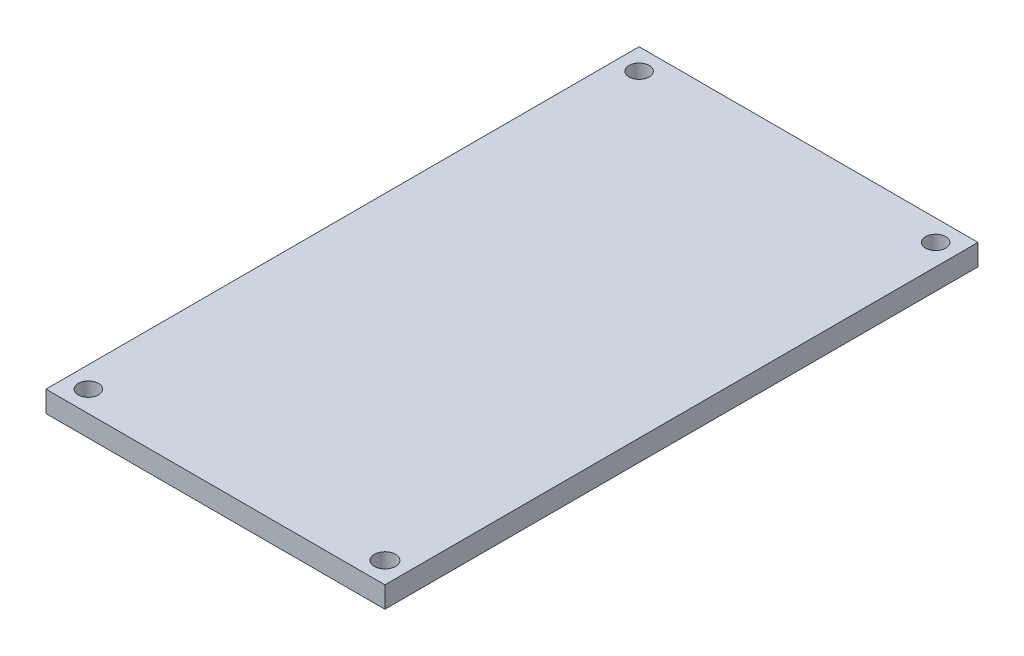
ISO-10303-21;
HEADER;
FILE_DESCRIPTION(('STEP AP214'),'2;1');
FILE_NAME('part.step','',(''),(''),'','','');
FILE_SCHEMA(('AUTOMOTIVE_DESIGN { 1 0 10303 214 1 1 1 1 }'));
ENDSEC;
DATA;
#1=APPLICATION_CONTEXT('core data for automotive mechanical design processes');
#2=APPLICATION_PROTOCOL_DEFINITION('international standard','automotive_design',2000,#1);
#3=PRODUCT_CONTEXT('',#1,'mechanical');
#4=PRODUCT('Part','Part','',(#3));
#5=PRODUCT_RELATED_PRODUCT_CATEGORY('part','',(#4));
#6=PRODUCT_DEFINITION_FORMATION('','',#4);
#7=PRODUCT_DEFINITION_CONTEXT('part definition',#1,'design');
#8=PRODUCT_DEFINITION('design','',#6,#7);
#9=PRODUCT_DEFINITION_SHAPE('','',#8);
#10=(LENGTH_UNIT() NAMED_UNIT(*) SI_UNIT(.MILLI.,.METRE.));
#11=(NAMED_UNIT(*) PLANE_ANGLE_UNIT() SI_UNIT($,.RADIAN.));
#12=(NAMED_UNIT(*) SI_UNIT($,.STERADIAN.) SOLID_ANGLE_UNIT());
#13=UNCERTAINTY_MEASURE_WITH_UNIT(LENGTH_MEASURE(1.E-05),#10,'distance_accuracy_value','');
#14=(GEOMETRIC_REPRESENTATION_CONTEXT(3) GLOBAL_UNCERTAINTY_ASSIGNED_CONTEXT((#13)) GLOBAL_UNIT_ASSIGNED_CONTEXT((#10,
#11,#12)) REPRESENTATION_CONTEXT('',''));
#15=CARTESIAN_POINT('',(0.,0.,0.));
#16=DIRECTION('',(0.,0.,1.));
#17=DIRECTION('',(1.,0.,0.));
#18=AXIS2_PLACEMENT_3D('',#15,#16,#17);
#19=CARTESIAN_POINT('',(0.,2.,0.));
#20=DIRECTION('',(0.,1.,0.));
#21=DIRECTION('',(0.,0.,1.));
#22=AXIS2_PLACEMENT_3D('',#19,#20,#21);
#23=PLANE('',#22);
#24=CARTESIAN_POINT('',(-14.,2.,26.));
#25=DIRECTION('',(0.,1.,0.));
#26=DIRECTION('',(0.,0.,1.));
#27=AXIS2_PLACEMENT_3D('',#24,#25,#26);
#28=CIRCLE('',#27,0.949999999999999);
#29=CARTESIAN_POINT('',(-14.,2.,26.95));
#30=VERTEX_POINT('',#29);
#31=EDGE_CURVE('E126',#30,#30,#28,.T.);
#32=ORIENTED_EDGE('',*,*,#31,.F.);
#33=EDGE_LOOP('',(#32));
#34=FACE_BOUND('',#33,.T.);
#35=CARTESIAN_POINT('',(-14.,2.,-26.));
#36=DIRECTION('',(0.,1.,0.));
#37=DIRECTION('',(0.,0.,1.));
#38=AXIS2_PLACEMENT_3D('',#35,#36,#37);
#39=CIRCLE('',#38,0.949999999999999);
#40=CARTESIAN_POINT('',(-14.,2.,-25.05));
#41=VERTEX_POINT('',#40);
#42=EDGE_CURVE('E105',#41,#41,#39,.T.);
#43=ORIENTED_EDGE('',*,*,#42,.F.);
#44=EDGE_LOOP('',(#43));
#45=FACE_BOUND('',#44,.T.);
#46=DIRECTION('',(0.,0.,1.));
#47=VECTOR('',#46,1.);
#48=CARTESIAN_POINT('',(-16.,2.,28.));
#49=LINE('',#48,#47);
#50=CARTESIAN_POINT('',(-16.,2.,-28.));
#51=VERTEX_POINT('',#50);
#52=CARTESIAN_POINT('',(-16.,2.,28.));
#53=VERTEX_POINT('',#52);
#54=EDGE_CURVE('E90',#51,#53,#49,.T.);
#55=ORIENTED_EDGE('',*,*,#54,.T.);
#56=DIRECTION('',(1.,0.,0.));
#57=VECTOR('',#56,1.);
#58=CARTESIAN_POINT('',(16.,2.,28.));
#59=LINE('',#58,#57);
#60=CARTESIAN_POINT('',(16.,2.,28.));
#61=VERTEX_POINT('',#60);
#62=EDGE_CURVE('E85',#53,#61,#59,.T.);
#63=ORIENTED_EDGE('',*,*,#62,.T.);
#64=DIRECTION('',(0.,0.,-1.));
#65=VECTOR('',#64,1.);
#66=CARTESIAN_POINT('',(16.,2.,28.));
#67=LINE('',#66,#65);
#68=CARTESIAN_POINT('',(16.,2.,-28.));
#69=VERTEX_POINT('',#68);
#70=EDGE_CURVE('E88',#61,#69,#67,.T.);
#71=ORIENTED_EDGE('',*,*,#70,.T.);
#72=DIRECTION('',(-1.,0.,0.));
#73=VECTOR('',#72,1.);
#74=CARTESIAN_POINT('',(16.,2.,-28.));
#75=LINE('',#74,#73);
#76=EDGE_CURVE('E55',#69,#51,#75,.T.);
#77=ORIENTED_EDGE('',*,*,#76,.T.);
#78=EDGE_LOOP('',(#55,#63,#71,#77));
#79=FACE_BOUND('',#78,.T.);
#80=CARTESIAN_POINT('',(14.,2.,-26.));
#81=DIRECTION('',(0.,1.,0.));
#82=DIRECTION('',(0.,0.,1.));
#83=AXIS2_PLACEMENT_3D('',#80,#81,#82);
#84=CIRCLE('',#83,0.949999999999999);
#85=CARTESIAN_POINT('',(14.,2.,-25.05));
#86=VERTEX_POINT('',#85);
#87=EDGE_CURVE('E120',#86,#86,#84,.T.);
#88=ORIENTED_EDGE('',*,*,#87,.F.);
#89=EDGE_LOOP('',(#88));
#90=FACE_BOUND('',#89,.T.);
#91=CARTESIAN_POINT('',(14.,2.,26.));
#92=DIRECTION('',(0.,1.,0.));
#93=DIRECTION('',(0.,0.,1.));
#94=AXIS2_PLACEMENT_3D('',#91,#92,#93);
#95=CIRCLE('',#94,1.);
#96=CARTESIAN_POINT('',(14.,2.,27.));
#97=VERTEX_POINT('',#96);
#98=EDGE_CURVE('E132',#97,#97,#95,.T.);
#99=ORIENTED_EDGE('',*,*,#98,.F.);
#100=EDGE_LOOP('',(#99));
#101=FACE_BOUND('',#100,.T.);
#102=ADVANCED_FACE('F38',(#34,#45,#79,#90,#101),#23,.T.);
#103=CARTESIAN_POINT('',(0.,0.,0.));
#104=DIRECTION('',(0.,1.,0.));
#105=DIRECTION('',(0.,0.,1.));
#106=AXIS2_PLACEMENT_3D('',#103,#104,#105);
#107=PLANE('',#106);
#108=DIRECTION('',(0.,0.,1.));
#109=VECTOR('',#108,1.);
#110=CARTESIAN_POINT('',(-16.,0.,28.));
#111=LINE('',#110,#109);
#112=CARTESIAN_POINT('',(-16.,0.,-28.));
#113=VERTEX_POINT('',#112);
#114=CARTESIAN_POINT('',(-16.,0.,28.));
#115=VERTEX_POINT('',#114);
#116=EDGE_CURVE('E102',#113,#115,#111,.T.);
#117=ORIENTED_EDGE('',*,*,#116,.F.);
#118=DIRECTION('',(-1.,0.,0.));
#119=VECTOR('',#118,1.);
#120=CARTESIAN_POINT('',(16.,0.,-28.));
#121=LINE('',#120,#119);
#122=CARTESIAN_POINT('',(16.,0.,-28.));
#123=VERTEX_POINT('',#122);
#124=EDGE_CURVE('E78',#123,#113,#121,.T.);
#125=ORIENTED_EDGE('',*,*,#124,.F.);
#126=DIRECTION('',(0.,0.,-1.));
#127=VECTOR('',#126,1.);
#128=CARTESIAN_POINT('',(16.,0.,28.));
#129=LINE('',#128,#127);
#130=CARTESIAN_POINT('',(16.,0.,28.));
#131=VERTEX_POINT('',#130);
#132=EDGE_CURVE('E72',#131,#123,#129,.T.);
#133=ORIENTED_EDGE('',*,*,#132,.F.);
#134=DIRECTION('',(1.,0.,0.));
#135=VECTOR('',#134,1.);
#136=CARTESIAN_POINT('',(16.,0.,28.));
#137=LINE('',#136,#135);
#138=EDGE_CURVE('E94',#115,#131,#137,.T.);
#139=ORIENTED_EDGE('',*,*,#138,.F.);
#140=EDGE_LOOP('',(#117,#125,#133,#139));
#141=FACE_BOUND('',#140,.T.);
#142=CARTESIAN_POINT('',(-14.,0.,-26.));
#143=DIRECTION('',(0.,1.,0.));
#144=DIRECTION('',(0.,0.,1.));
#145=AXIS2_PLACEMENT_3D('',#142,#143,#144);
#146=CIRCLE('',#145,0.949999999999999);
#147=CARTESIAN_POINT('',(-14.,0.,-25.05));
#148=VERTEX_POINT('',#147);
#149=EDGE_CURVE('E117',#148,#148,#146,.T.);
#150=ORIENTED_EDGE('',*,*,#149,.T.);
#151=EDGE_LOOP('',(#150));
#152=FACE_BOUND('',#151,.T.);
#153=CARTESIAN_POINT('',(14.,0.,-26.));
#154=DIRECTION('',(0.,1.,0.));
#155=DIRECTION('',(0.,0.,1.));
#156=AXIS2_PLACEMENT_3D('',#153,#154,#155);
#157=CIRCLE('',#156,0.949999999999999);
#158=CARTESIAN_POINT('',(14.,0.,-25.05));
#159=VERTEX_POINT('',#158);
#160=EDGE_CURVE('E123',#159,#159,#157,.T.);
#161=ORIENTED_EDGE('',*,*,#160,.T.);
#162=EDGE_LOOP('',(#161));
#163=FACE_BOUND('',#162,.T.);
#164=CARTESIAN_POINT('',(-14.,0.,26.));
#165=DIRECTION('',(0.,1.,0.));
#166=DIRECTION('',(0.,0.,1.));
#167=AXIS2_PLACEMENT_3D('',#164,#165,#166);
#168=CIRCLE('',#167,0.949999999999999);
#169=CARTESIAN_POINT('',(-14.,0.,26.95));
#170=VERTEX_POINT('',#169);
#171=EDGE_CURVE('E129',#170,#170,#168,.T.);
#172=ORIENTED_EDGE('',*,*,#171,.T.);
#173=EDGE_LOOP('',(#172));
#174=FACE_BOUND('',#173,.T.);
#175=CARTESIAN_POINT('',(14.,0.,26.));
#176=DIRECTION('',(0.,1.,0.));
#177=DIRECTION('',(0.,0.,1.));
#178=AXIS2_PLACEMENT_3D('',#175,#176,#177);
#179=CIRCLE('',#178,1.);
#180=CARTESIAN_POINT('',(14.,0.,27.));
#181=VERTEX_POINT('',#180);
#182=EDGE_CURVE('E135',#181,#181,#179,.T.);
#183=ORIENTED_EDGE('',*,*,#182,.T.);
#184=EDGE_LOOP('',(#183));
#185=FACE_BOUND('',#184,.T.);
#186=ADVANCED_FACE('F113',(#141,#152,#163,#174,#185),#107,.F.);
#187=CARTESIAN_POINT('',(-16.,2.,28.));
#188=DIRECTION('',(1.,0.,0.));
#189=DIRECTION('',(0.,0.,-1.));
#190=AXIS2_PLACEMENT_3D('',#187,#188,#189);
#191=PLANE('',#190);
#192=ORIENTED_EDGE('',*,*,#116,.T.);
#193=DIRECTION('',(0.,-1.,0.));
#194=VECTOR('',#193,1.);
#195=CARTESIAN_POINT('',(-16.,2.,28.));
#196=LINE('',#195,#194);
#197=EDGE_CURVE('E11',#53,#115,#196,.T.);
#198=ORIENTED_EDGE('',*,*,#197,.F.);
#199=ORIENTED_EDGE('',*,*,#54,.F.);
#200=DIRECTION('',(0.,-1.,0.));
#201=VECTOR('',#200,1.);
#202=CARTESIAN_POINT('',(-16.,2.,-28.));
#203=LINE('',#202,#201);
#204=EDGE_CURVE('E98',#51,#113,#203,.T.);
#205=ORIENTED_EDGE('',*,*,#204,.T.);
#206=EDGE_LOOP('',(#192,#198,#199,#205));
#207=FACE_BOUND('',#206,.T.);
#208=ADVANCED_FACE('F40',(#207),#191,.F.);
#209=CARTESIAN_POINT('',(16.,2.,28.));
#210=DIRECTION('',(0.,0.,-1.));
#211=DIRECTION('',(-1.,0.,0.));
#212=AXIS2_PLACEMENT_3D('',#209,#210,#211);
#213=PLANE('',#212);
#214=ORIENTED_EDGE('',*,*,#138,.T.);
#215=DIRECTION('',(0.,-1.,0.));
#216=VECTOR('',#215,1.);
#217=CARTESIAN_POINT('',(16.,2.,28.));
#218=LINE('',#217,#216);
#219=EDGE_CURVE('E47',#61,#131,#218,.T.);
#220=ORIENTED_EDGE('',*,*,#219,.F.);
#221=ORIENTED_EDGE('',*,*,#62,.F.);
#222=ORIENTED_EDGE('',*,*,#197,.T.);
#223=EDGE_LOOP('',(#214,#220,#221,#222));
#224=FACE_BOUND('',#223,.T.);
#225=ADVANCED_FACE('F93',(#224),#213,.F.);
#226=CARTESIAN_POINT('',(16.,2.,28.));
#227=DIRECTION('',(-1.,0.,0.));
#228=DIRECTION('',(0.,0.,1.));
#229=AXIS2_PLACEMENT_3D('',#226,#227,#228);
#230=PLANE('',#229);
#231=ORIENTED_EDGE('',*,*,#132,.T.);
#232=DIRECTION('',(0.,-1.,0.));
#233=VECTOR('',#232,1.);
#234=CARTESIAN_POINT('',(16.,2.,-28.));
#235=LINE('',#234,#233);
#236=EDGE_CURVE('E95',#69,#123,#235,.T.);
#237=ORIENTED_EDGE('',*,*,#236,.F.);
#238=ORIENTED_EDGE('',*,*,#70,.F.);
#239=ORIENTED_EDGE('',*,*,#219,.T.);
#240=EDGE_LOOP('',(#231,#237,#238,#239));
#241=FACE_BOUND('',#240,.T.);
#242=ADVANCED_FACE('F96',(#241),#230,.F.);
#243=CARTESIAN_POINT('',(16.,2.,-28.));
#244=DIRECTION('',(0.,0.,1.));
#245=DIRECTION('',(1.,0.,0.));
#246=AXIS2_PLACEMENT_3D('',#243,#244,#245);
#247=PLANE('',#246);
#248=ORIENTED_EDGE('',*,*,#124,.T.);
#249=ORIENTED_EDGE('',*,*,#204,.F.);
#250=ORIENTED_EDGE('',*,*,#76,.F.);
#251=ORIENTED_EDGE('',*,*,#236,.T.);
#252=EDGE_LOOP('',(#248,#249,#250,#251));
#253=FACE_BOUND('',#252,.T.);
#254=ADVANCED_FACE('F110',(#253),#247,.F.);
#255=CARTESIAN_POINT('',(-14.,2.,-26.));
#256=DIRECTION('',(0.,-1.,0.));
#257=DIRECTION('',(0.,0.,-1.));
#258=AXIS2_PLACEMENT_3D('',#255,#256,#257);
#259=CYLINDRICAL_SURFACE('',#258,0.949999999999999);
#260=ORIENTED_EDGE('',*,*,#42,.T.);
#261=EDGE_LOOP('',(#260));
#262=FACE_BOUND('',#261,.T.);
#263=ORIENTED_EDGE('',*,*,#149,.F.);
#264=EDGE_LOOP('',(#263));
#265=FACE_BOUND('',#264,.T.);
#266=ADVANCED_FACE('F154',(#262,#265),#259,.F.);
#267=CARTESIAN_POINT('',(14.,2.,-26.));
#268=DIRECTION('',(0.,-1.,0.));
#269=DIRECTION('',(0.,0.,-1.));
#270=AXIS2_PLACEMENT_3D('',#267,#268,#269);
#271=CYLINDRICAL_SURFACE('',#270,0.949999999999999);
#272=ORIENTED_EDGE('',*,*,#87,.T.);
#273=EDGE_LOOP('',(#272));
#274=FACE_BOUND('',#273,.T.);
#275=ORIENTED_EDGE('',*,*,#160,.F.);
#276=EDGE_LOOP('',(#275));
#277=FACE_BOUND('',#276,.T.);
#278=ADVANCED_FACE('F208',(#274,#277),#271,.F.);
#279=CARTESIAN_POINT('',(-14.,2.,26.));
#280=DIRECTION('',(0.,-1.,0.));
#281=DIRECTION('',(0.,0.,-1.));
#282=AXIS2_PLACEMENT_3D('',#279,#280,#281);
#283=CYLINDRICAL_SURFACE('',#282,0.949999999999999);
#284=ORIENTED_EDGE('',*,*,#31,.T.);
#285=EDGE_LOOP('',(#284));
#286=FACE_BOUND('',#285,.T.);
#287=ORIENTED_EDGE('',*,*,#171,.F.);
#288=EDGE_LOOP('',(#287));
#289=FACE_BOUND('',#288,.T.);
#290=ADVANCED_FACE('F217',(#286,#289),#283,.F.);
#291=CARTESIAN_POINT('',(14.,2.,26.));
#292=DIRECTION('',(0.,-1.,0.));
#293=DIRECTION('',(0.,0.,-1.));
#294=AXIS2_PLACEMENT_3D('',#291,#292,#293);
#295=CYLINDRICAL_SURFACE('',#294,1.);
#296=ORIENTED_EDGE('',*,*,#98,.T.);
#297=EDGE_LOOP('',(#296));
#298=FACE_BOUND('',#297,.T.);
#299=ORIENTED_EDGE('',*,*,#182,.F.);
#300=EDGE_LOOP('',(#299));
#301=FACE_BOUND('',#300,.T.);
#302=ADVANCED_FACE('F141',(#298,#301),#295,.F.);
#303=CLOSED_SHELL('',(#102,#186,#208,#225,#242,#254,#266,#278,#290,#302));
#304=MANIFOLD_SOLID_BREP('B2',#303);
#305=ADVANCED_BREP_SHAPE_REPRESENTATION('',(#18,#304),#14);
#306=SHAPE_DEFINITION_REPRESENTATION(#9,#305);
ENDSEC;
END-ISO-10303-21;
